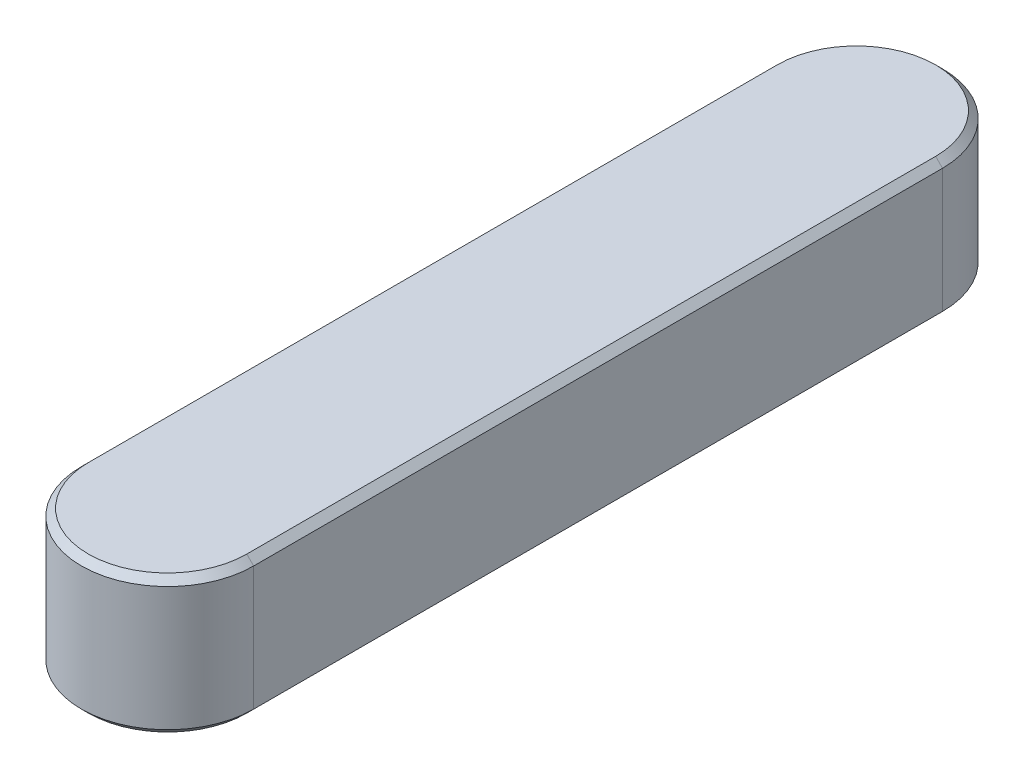
ISO-10303-21;
HEADER;
FILE_DESCRIPTION(('STEP AP214'),'2;1');
FILE_NAME('part.step','',(''),(''),'','','');
FILE_SCHEMA(('AUTOMOTIVE_DESIGN { 1 0 10303 214 1 1 1 1 }'));
ENDSEC;
DATA;
#1=APPLICATION_CONTEXT('core data for automotive mechanical design processes');
#2=APPLICATION_PROTOCOL_DEFINITION('international standard','automotive_design',2000,#1);
#3=PRODUCT_CONTEXT('',#1,'mechanical');
#4=PRODUCT('Part','Part','',(#3));
#5=PRODUCT_RELATED_PRODUCT_CATEGORY('part','',(#4));
#6=PRODUCT_DEFINITION_FORMATION('','',#4);
#7=PRODUCT_DEFINITION_CONTEXT('part definition',#1,'design');
#8=PRODUCT_DEFINITION('design','',#6,#7);
#9=PRODUCT_DEFINITION_SHAPE('','',#8);
#10=(LENGTH_UNIT() NAMED_UNIT(*) SI_UNIT(.MILLI.,.METRE.));
#11=(NAMED_UNIT(*) PLANE_ANGLE_UNIT() SI_UNIT($,.RADIAN.));
#12=(NAMED_UNIT(*) SI_UNIT($,.STERADIAN.) SOLID_ANGLE_UNIT());
#13=UNCERTAINTY_MEASURE_WITH_UNIT(LENGTH_MEASURE(1.E-05),#10,'distance_accuracy_value','');
#14=(GEOMETRIC_REPRESENTATION_CONTEXT(3) GLOBAL_UNCERTAINTY_ASSIGNED_CONTEXT((#13)) GLOBAL_UNIT_ASSIGNED_CONTEXT((#10,
#11,#12)) REPRESENTATION_CONTEXT('',''));
#15=CARTESIAN_POINT('',(0.,0.,0.));
#16=DIRECTION('',(0.,0.,1.));
#17=DIRECTION('',(1.,0.,0.));
#18=AXIS2_PLACEMENT_3D('',#15,#16,#17);
#19=CARTESIAN_POINT('',(2.3,4.,-10.));
#20=DIRECTION('',(0.707106781186551,0.707106781186544,0.));
#21=DIRECTION('',(0.,0.,-1.));
#22=AXIS2_PLACEMENT_3D('',#19,#20,#21);
#23=PLANE('',#22);
#24=DIRECTION('',(0.707106781186544,-0.707106781186551,0.));
#25=VECTOR('',#24,1.);
#26=CARTESIAN_POINT('',(2.3,4.,10.));
#27=LINE('',#26,#25);
#28=CARTESIAN_POINT('',(2.3,4.,10.));
#29=VERTEX_POINT('',#28);
#30=CARTESIAN_POINT('',(2.5,3.8,10.));
#31=VERTEX_POINT('',#30);
#32=EDGE_CURVE('E21',#29,#31,#27,.T.);
#33=ORIENTED_EDGE('',*,*,#32,.T.);
#34=DIRECTION('',(0.,0.,1.));
#35=VECTOR('',#34,1.);
#36=CARTESIAN_POINT('',(2.5,3.8,10.));
#37=LINE('',#36,#35);
#38=CARTESIAN_POINT('',(2.5,3.8,-10.));
#39=VERTEX_POINT('',#38);
#40=EDGE_CURVE('E120',#39,#31,#37,.T.);
#41=ORIENTED_EDGE('',*,*,#40,.F.);
#42=DIRECTION('',(-0.707106781186544,0.707106781186551,0.));
#43=VECTOR('',#42,1.);
#44=CARTESIAN_POINT('',(2.5,3.8,-10.));
#45=LINE('',#44,#43);
#46=CARTESIAN_POINT('',(2.3,4.,-10.));
#47=VERTEX_POINT('',#46);
#48=EDGE_CURVE('E11',#39,#47,#45,.T.);
#49=ORIENTED_EDGE('',*,*,#48,.T.);
#50=DIRECTION('',(0.,0.,-1.));
#51=VECTOR('',#50,1.);
#52=CARTESIAN_POINT('',(2.3,4.,-10.));
#53=LINE('',#52,#51);
#54=EDGE_CURVE('E153',#29,#47,#53,.T.);
#55=ORIENTED_EDGE('',*,*,#54,.F.);
#56=EDGE_LOOP('',(#33,#41,#49,#55));
#57=FACE_BOUND('',#56,.T.);
#58=ADVANCED_FACE('F17',(#57),#23,.T.);
#59=CARTESIAN_POINT('',(0.,4.,-10.));
#60=DIRECTION('',(0.,-1.,0.));
#61=DIRECTION('',(0.,0.,-1.));
#62=AXIS2_PLACEMENT_3D('',#59,#60,#61);
#63=CONICAL_SURFACE('',#62,2.3,0.785398163397443);
#64=DIRECTION('',(0.707106781186544,0.707106781186551,0.));
#65=VECTOR('',#64,1.);
#66=CARTESIAN_POINT('',(-2.5,3.8,-10.));
#67=LINE('',#66,#65);
#68=CARTESIAN_POINT('',(-2.5,3.8,-10.));
#69=VERTEX_POINT('',#68);
#70=CARTESIAN_POINT('',(-2.3,4.,-10.));
#71=VERTEX_POINT('',#70);
#72=EDGE_CURVE('E215',#69,#71,#67,.T.);
#73=ORIENTED_EDGE('',*,*,#72,.T.);
#74=CARTESIAN_POINT('',(0.,4.,-10.));
#75=DIRECTION('',(0.,1.,0.));
#76=DIRECTION('',(0.,0.,1.));
#77=AXIS2_PLACEMENT_3D('',#74,#75,#76);
#78=CIRCLE('',#77,2.3);
#79=EDGE_CURVE('E115',#47,#71,#78,.T.);
#80=ORIENTED_EDGE('',*,*,#79,.F.);
#81=ORIENTED_EDGE('',*,*,#48,.F.);
#82=CARTESIAN_POINT('',(0.,3.8,-10.));
#83=DIRECTION('',(0.,-1.,0.));
#84=DIRECTION('',(0.,0.,1.));
#85=AXIS2_PLACEMENT_3D('',#82,#83,#84);
#86=CIRCLE('',#85,2.5);
#87=EDGE_CURVE('E112',#69,#39,#86,.T.);
#88=ORIENTED_EDGE('',*,*,#87,.F.);
#89=EDGE_LOOP('',(#73,#80,#81,#88));
#90=FACE_BOUND('',#89,.T.);
#91=ADVANCED_FACE('F110',(#90),#63,.T.);
#92=CARTESIAN_POINT('',(0.,4.,10.));
#93=DIRECTION('',(0.,-1.,0.));
#94=DIRECTION('',(0.,0.,-1.));
#95=AXIS2_PLACEMENT_3D('',#92,#93,#94);
#96=CONICAL_SURFACE('',#95,2.3,0.785398163397443);
#97=DIRECTION('',(-0.707106781186544,-0.707106781186551,0.));
#98=VECTOR('',#97,1.);
#99=CARTESIAN_POINT('',(-2.3,4.,10.));
#100=LINE('',#99,#98);
#101=CARTESIAN_POINT('',(-2.3,4.,10.));
#102=VERTEX_POINT('',#101);
#103=CARTESIAN_POINT('',(-2.5,3.8,10.));
#104=VERTEX_POINT('',#103);
#105=EDGE_CURVE('E217',#102,#104,#100,.T.);
#106=ORIENTED_EDGE('',*,*,#105,.T.);
#107=CARTESIAN_POINT('',(0.,3.8,10.));
#108=DIRECTION('',(0.,-1.,0.));
#109=DIRECTION('',(0.,0.,1.));
#110=AXIS2_PLACEMENT_3D('',#107,#108,#109);
#111=CIRCLE('',#110,2.5);
#112=EDGE_CURVE('E183',#31,#104,#111,.T.);
#113=ORIENTED_EDGE('',*,*,#112,.F.);
#114=ORIENTED_EDGE('',*,*,#32,.F.);
#115=CARTESIAN_POINT('',(0.,4.,10.));
#116=DIRECTION('',(0.,1.,0.));
#117=DIRECTION('',(0.,0.,1.));
#118=AXIS2_PLACEMENT_3D('',#115,#116,#117);
#119=CIRCLE('',#118,2.3);
#120=EDGE_CURVE('E126',#102,#29,#119,.T.);
#121=ORIENTED_EDGE('',*,*,#120,.F.);
#122=EDGE_LOOP('',(#106,#113,#114,#121));
#123=FACE_BOUND('',#122,.T.);
#124=ADVANCED_FACE('F347',(#123),#96,.T.);
#125=CARTESIAN_POINT('',(-2.3,4.,-10.));
#126=DIRECTION('',(-0.707106781186551,0.707106781186544,0.));
#127=DIRECTION('',(0.,0.,1.));
#128=AXIS2_PLACEMENT_3D('',#125,#126,#127);
#129=PLANE('',#128);
#130=ORIENTED_EDGE('',*,*,#72,.F.);
#131=DIRECTION('',(0.,0.,-1.));
#132=VECTOR('',#131,1.);
#133=CARTESIAN_POINT('',(-2.5,3.8,-10.));
#134=LINE('',#133,#132);
#135=EDGE_CURVE('E170',#104,#69,#134,.T.);
#136=ORIENTED_EDGE('',*,*,#135,.F.);
#137=ORIENTED_EDGE('',*,*,#105,.F.);
#138=DIRECTION('',(0.,0.,1.));
#139=VECTOR('',#138,1.);
#140=CARTESIAN_POINT('',(-2.3,4.,10.));
#141=LINE('',#140,#139);
#142=EDGE_CURVE('E161',#71,#102,#141,.T.);
#143=ORIENTED_EDGE('',*,*,#142,.F.);
#144=EDGE_LOOP('',(#130,#136,#137,#143));
#145=FACE_BOUND('',#144,.T.);
#146=ADVANCED_FACE('F338',(#145),#129,.T.);
#147=CARTESIAN_POINT('',(-2.5,0.200000000000005,-10.));
#148=DIRECTION('',(0.707106781186545,0.70710678118655,0.));
#149=DIRECTION('',(0.,0.,-1.));
#150=AXIS2_PLACEMENT_3D('',#147,#148,#149);
#151=PLANE('',#150);
#152=DIRECTION('',(0.70710678118655,-0.707106781186545,0.));
#153=VECTOR('',#152,1.);
#154=CARTESIAN_POINT('',(-2.5,0.200000000000005,-10.));
#155=LINE('',#154,#153);
#156=CARTESIAN_POINT('',(-2.5,0.200000000000005,-10.));
#157=VERTEX_POINT('',#156);
#158=CARTESIAN_POINT('',(-2.3,0.,-10.));
#159=VERTEX_POINT('',#158);
#160=EDGE_CURVE('E51',#157,#159,#155,.T.);
#161=ORIENTED_EDGE('',*,*,#160,.T.);
#162=DIRECTION('',(0.,0.,-1.));
#163=VECTOR('',#162,1.);
#164=CARTESIAN_POINT('',(-2.3,0.,-10.));
#165=LINE('',#164,#163);
#166=CARTESIAN_POINT('',(-2.3,0.,10.));
#167=VERTEX_POINT('',#166);
#168=EDGE_CURVE('E160',#167,#159,#165,.T.);
#169=ORIENTED_EDGE('',*,*,#168,.F.);
#170=DIRECTION('',(-0.70710678118655,0.707106781186545,0.));
#171=VECTOR('',#170,1.);
#172=CARTESIAN_POINT('',(-2.3,0.,10.));
#173=LINE('',#172,#171);
#174=CARTESIAN_POINT('',(-2.5,0.200000000000005,10.));
#175=VERTEX_POINT('',#174);
#176=EDGE_CURVE('E212',#167,#175,#173,.T.);
#177=ORIENTED_EDGE('',*,*,#176,.T.);
#178=DIRECTION('',(0.,0.,1.));
#179=VECTOR('',#178,1.);
#180=CARTESIAN_POINT('',(-2.5,0.200000000000005,-10.));
#181=LINE('',#180,#179);
#182=EDGE_CURVE('E137',#157,#175,#181,.T.);
#183=ORIENTED_EDGE('',*,*,#182,.F.);
#184=EDGE_LOOP('',(#161,#169,#177,#183));
#185=FACE_BOUND('',#184,.T.);
#186=ADVANCED_FACE('F327',(#185),#151,.F.);
#187=CARTESIAN_POINT('',(0.,0.200000000000005,10.));
#188=DIRECTION('',(0.,1.,0.));
#189=DIRECTION('',(0.,0.,1.));
#190=AXIS2_PLACEMENT_3D('',#187,#188,#189);
#191=CONICAL_SURFACE('',#190,2.5,0.785398163397452);
#192=DIRECTION('',(0.70710678118655,0.707106781186545,0.));
#193=VECTOR('',#192,1.);
#194=CARTESIAN_POINT('',(2.3,0.,10.));
#195=LINE('',#194,#193);
#196=CARTESIAN_POINT('',(2.3,0.,10.));
#197=VERTEX_POINT('',#196);
#198=CARTESIAN_POINT('',(2.5,0.200000000000005,10.));
#199=VERTEX_POINT('',#198);
#200=EDGE_CURVE('E205',#197,#199,#195,.T.);
#201=ORIENTED_EDGE('',*,*,#200,.T.);
#202=CARTESIAN_POINT('',(0.,0.200000000000005,10.));
#203=DIRECTION('',(0.,1.,0.));
#204=DIRECTION('',(0.,0.,1.));
#205=AXIS2_PLACEMENT_3D('',#202,#203,#204);
#206=CIRCLE('',#205,2.5);
#207=EDGE_CURVE('E165',#175,#199,#206,.T.);
#208=ORIENTED_EDGE('',*,*,#207,.F.);
#209=ORIENTED_EDGE('',*,*,#176,.F.);
#210=CARTESIAN_POINT('',(0.,0.,10.));
#211=DIRECTION('',(0.,-1.,0.));
#212=DIRECTION('',(0.,0.,1.));
#213=AXIS2_PLACEMENT_3D('',#210,#211,#212);
#214=CIRCLE('',#213,2.3);
#215=EDGE_CURVE('E156',#197,#167,#214,.T.);
#216=ORIENTED_EDGE('',*,*,#215,.F.);
#217=EDGE_LOOP('',(#201,#208,#209,#216));
#218=FACE_BOUND('',#217,.T.);
#219=ADVANCED_FACE('F319',(#218),#191,.T.);
#220=CARTESIAN_POINT('',(0.,0.200000000000005,-10.));
#221=DIRECTION('',(0.,1.,0.));
#222=DIRECTION('',(0.,0.,1.));
#223=AXIS2_PLACEMENT_3D('',#220,#221,#222);
#224=CONICAL_SURFACE('',#223,2.5,0.785398163397452);
#225=DIRECTION('',(-0.70710678118655,-0.707106781186545,0.));
#226=VECTOR('',#225,1.);
#227=CARTESIAN_POINT('',(2.5,0.200000000000005,-10.));
#228=LINE('',#227,#226);
#229=CARTESIAN_POINT('',(2.5,0.200000000000005,-10.));
#230=VERTEX_POINT('',#229);
#231=CARTESIAN_POINT('',(2.3,0.,-10.));
#232=VERTEX_POINT('',#231);
#233=EDGE_CURVE('E40',#230,#232,#228,.T.);
#234=ORIENTED_EDGE('',*,*,#233,.T.);
#235=CARTESIAN_POINT('',(0.,0.,-10.));
#236=DIRECTION('',(0.,-1.,0.));
#237=DIRECTION('',(0.,0.,1.));
#238=AXIS2_PLACEMENT_3D('',#235,#236,#237);
#239=CIRCLE('',#238,2.3);
#240=EDGE_CURVE('E192',#159,#232,#239,.T.);
#241=ORIENTED_EDGE('',*,*,#240,.F.);
#242=ORIENTED_EDGE('',*,*,#160,.F.);
#243=CARTESIAN_POINT('',(0.,0.200000000000005,-10.));
#244=DIRECTION('',(0.,1.,0.));
#245=DIRECTION('',(0.,0.,1.));
#246=AXIS2_PLACEMENT_3D('',#243,#244,#245);
#247=CIRCLE('',#246,2.5);
#248=EDGE_CURVE('E143',#230,#157,#247,.T.);
#249=ORIENTED_EDGE('',*,*,#248,.F.);
#250=EDGE_LOOP('',(#234,#241,#242,#249));
#251=FACE_BOUND('',#250,.T.);
#252=ADVANCED_FACE('F19',(#251),#224,.T.);
#253=CARTESIAN_POINT('',(2.5,0.200000000000005,-10.));
#254=DIRECTION('',(-0.707106781186545,0.70710678118655,0.));
#255=DIRECTION('',(0.,0.,1.));
#256=AXIS2_PLACEMENT_3D('',#253,#254,#255);
#257=PLANE('',#256);
#258=ORIENTED_EDGE('',*,*,#200,.F.);
#259=DIRECTION('',(0.,0.,1.));
#260=VECTOR('',#259,1.);
#261=CARTESIAN_POINT('',(2.3,0.,-10.));
#262=LINE('',#261,#260);
#263=EDGE_CURVE('E201',#232,#197,#262,.T.);
#264=ORIENTED_EDGE('',*,*,#263,.F.);
#265=ORIENTED_EDGE('',*,*,#233,.F.);
#266=DIRECTION('',(0.,0.,-1.));
#267=VECTOR('',#266,1.);
#268=CARTESIAN_POINT('',(2.5,0.200000000000005,-10.));
#269=LINE('',#268,#267);
#270=EDGE_CURVE('E127',#199,#230,#269,.T.);
#271=ORIENTED_EDGE('',*,*,#270,.F.);
#272=EDGE_LOOP('',(#258,#264,#265,#271));
#273=FACE_BOUND('',#272,.T.);
#274=ADVANCED_FACE('F299',(#273),#257,.F.);
#275=CARTESIAN_POINT('',(0.,0.,-10.));
#276=DIRECTION('',(0.,1.,0.));
#277=DIRECTION('',(1.,0.,0.));
#278=AXIS2_PLACEMENT_3D('',#275,#276,#277);
#279=PLANE('',#278);
#280=ORIENTED_EDGE('',*,*,#215,.T.);
#281=ORIENTED_EDGE('',*,*,#168,.T.);
#282=ORIENTED_EDGE('',*,*,#240,.T.);
#283=ORIENTED_EDGE('',*,*,#263,.T.);
#284=EDGE_LOOP('',(#280,#281,#282,#283));
#285=FACE_BOUND('',#284,.T.);
#286=ADVANCED_FACE('F287',(#285),#279,.F.);
#287=CARTESIAN_POINT('',(0.,4.,-10.));
#288=DIRECTION('',(0.,1.,0.));
#289=DIRECTION('',(1.,0.,0.));
#290=AXIS2_PLACEMENT_3D('',#287,#288,#289);
#291=PLANE('',#290);
#292=ORIENTED_EDGE('',*,*,#120,.T.);
#293=ORIENTED_EDGE('',*,*,#54,.T.);
#294=ORIENTED_EDGE('',*,*,#79,.T.);
#295=ORIENTED_EDGE('',*,*,#142,.T.);
#296=EDGE_LOOP('',(#292,#293,#294,#295));
#297=FACE_BOUND('',#296,.T.);
#298=ADVANCED_FACE('F276',(#297),#291,.T.);
#299=CARTESIAN_POINT('',(2.5,4.,-10.));
#300=DIRECTION('',(-1.,0.,0.));
#301=DIRECTION('',(0.,1.,0.));
#302=AXIS2_PLACEMENT_3D('',#299,#300,#301);
#303=PLANE('',#302);
#304=DIRECTION('',(0.,-1.,0.));
#305=VECTOR('',#304,1.);
#306=CARTESIAN_POINT('',(2.5,4.,10.));
#307=LINE('',#306,#305);
#308=EDGE_CURVE('E169',#31,#199,#307,.T.);
#309=ORIENTED_EDGE('',*,*,#308,.T.);
#310=ORIENTED_EDGE('',*,*,#270,.T.);
#311=DIRECTION('',(0.,-1.,0.));
#312=VECTOR('',#311,1.);
#313=CARTESIAN_POINT('',(2.5,4.,-10.));
#314=LINE('',#313,#312);
#315=EDGE_CURVE('E133',#39,#230,#314,.T.);
#316=ORIENTED_EDGE('',*,*,#315,.F.);
#317=ORIENTED_EDGE('',*,*,#40,.T.);
#318=EDGE_LOOP('',(#309,#310,#316,#317));
#319=FACE_BOUND('',#318,.T.);
#320=ADVANCED_FACE('F140',(#319),#303,.F.);
#321=CARTESIAN_POINT('',(0.,4.,10.));
#322=DIRECTION('',(0.,-1.,0.));
#323=DIRECTION('',(0.,0.,-1.));
#324=AXIS2_PLACEMENT_3D('',#321,#322,#323);
#325=CYLINDRICAL_SURFACE('',#324,2.5);
#326=DIRECTION('',(0.,-1.,0.));
#327=VECTOR('',#326,1.);
#328=CARTESIAN_POINT('',(-2.5,4.,10.));
#329=LINE('',#328,#327);
#330=EDGE_CURVE('E173',#104,#175,#329,.T.);
#331=ORIENTED_EDGE('',*,*,#330,.T.);
#332=ORIENTED_EDGE('',*,*,#207,.T.);
#333=ORIENTED_EDGE('',*,*,#308,.F.);
#334=ORIENTED_EDGE('',*,*,#112,.T.);
#335=EDGE_LOOP('',(#331,#332,#333,#334));
#336=FACE_BOUND('',#335,.T.);
#337=ADVANCED_FACE('F252',(#336),#325,.T.);
#338=CARTESIAN_POINT('',(-2.5,4.,-10.));
#339=DIRECTION('',(1.,0.,0.));
#340=DIRECTION('',(0.,0.,-1.));
#341=AXIS2_PLACEMENT_3D('',#338,#339,#340);
#342=PLANE('',#341);
#343=DIRECTION('',(0.,-1.,0.));
#344=VECTOR('',#343,1.);
#345=CARTESIAN_POINT('',(-2.5,4.,-10.));
#346=LINE('',#345,#344);
#347=EDGE_CURVE('E135',#69,#157,#346,.T.);
#348=ORIENTED_EDGE('',*,*,#347,.T.);
#349=ORIENTED_EDGE('',*,*,#182,.T.);
#350=ORIENTED_EDGE('',*,*,#330,.F.);
#351=ORIENTED_EDGE('',*,*,#135,.T.);
#352=EDGE_LOOP('',(#348,#349,#350,#351));
#353=FACE_BOUND('',#352,.T.);
#354=ADVANCED_FACE('F241',(#353),#342,.F.);
#355=CARTESIAN_POINT('',(0.,4.,-10.));
#356=DIRECTION('',(0.,-1.,0.));
#357=DIRECTION('',(0.,0.,-1.));
#358=AXIS2_PLACEMENT_3D('',#355,#356,#357);
#359=CYLINDRICAL_SURFACE('',#358,2.5);
#360=ORIENTED_EDGE('',*,*,#315,.T.);
#361=ORIENTED_EDGE('',*,*,#248,.T.);
#362=ORIENTED_EDGE('',*,*,#347,.F.);
#363=ORIENTED_EDGE('',*,*,#87,.T.);
#364=EDGE_LOOP('',(#360,#361,#362,#363));
#365=FACE_BOUND('',#364,.T.);
#366=ADVANCED_FACE('F131',(#365),#359,.T.);
#367=CLOSED_SHELL('',(#58,#91,#124,#146,#186,#219,#252,#274,#286,#298,#320,#337,#354,#366));
#368=MANIFOLD_SOLID_BREP('B1',#367);
#369=ADVANCED_BREP_SHAPE_REPRESENTATION('',(#18,#368),#14);
#370=SHAPE_DEFINITION_REPRESENTATION(#9,#369);
ENDSEC;
END-ISO-10303-21;
